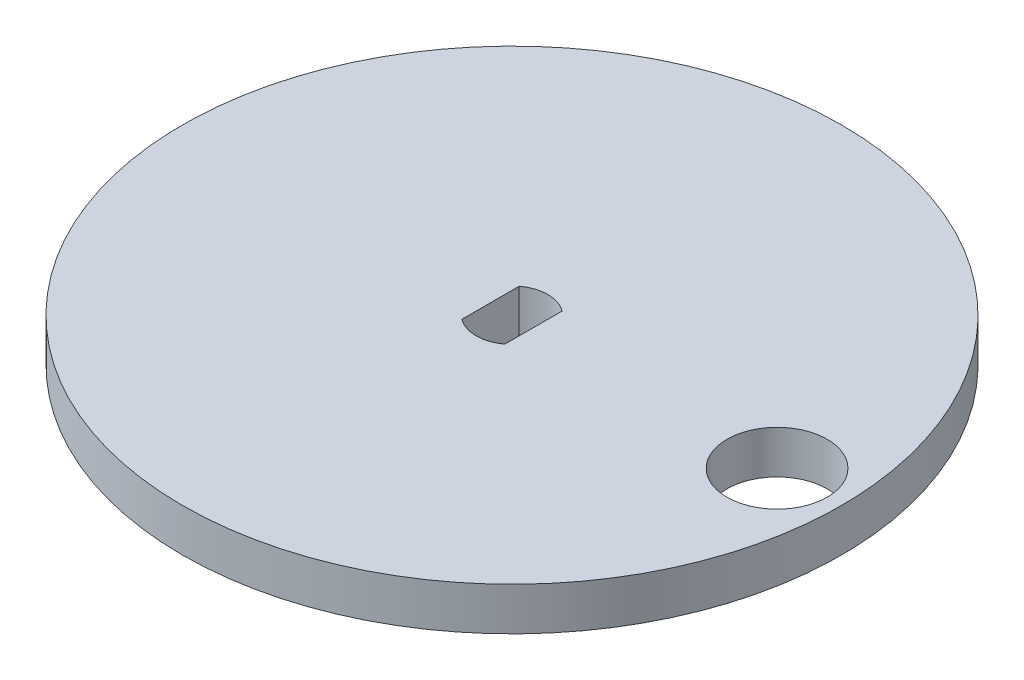
ISO-10303-21;
HEADER;
FILE_DESCRIPTION(('STEP AP214'),'2;1');
FILE_NAME('part.step','',(''),(''),'','','');
FILE_SCHEMA(('AUTOMOTIVE_DESIGN { 1 0 10303 214 1 1 1 1 }'));
ENDSEC;
DATA;
#1=APPLICATION_CONTEXT('core data for automotive mechanical design processes');
#2=APPLICATION_PROTOCOL_DEFINITION('international standard','automotive_design',2000,#1);
#3=PRODUCT_CONTEXT('',#1,'mechanical');
#4=PRODUCT('Part','Part','',(#3));
#5=PRODUCT_RELATED_PRODUCT_CATEGORY('part','',(#4));
#6=PRODUCT_DEFINITION_FORMATION('','',#4);
#7=PRODUCT_DEFINITION_CONTEXT('part definition',#1,'design');
#8=PRODUCT_DEFINITION('design','',#6,#7);
#9=PRODUCT_DEFINITION_SHAPE('','',#8);
#10=(LENGTH_UNIT() NAMED_UNIT(*) SI_UNIT(.MILLI.,.METRE.));
#11=(NAMED_UNIT(*) PLANE_ANGLE_UNIT() SI_UNIT($,.RADIAN.));
#12=(NAMED_UNIT(*) SI_UNIT($,.STERADIAN.) SOLID_ANGLE_UNIT());
#13=UNCERTAINTY_MEASURE_WITH_UNIT(LENGTH_MEASURE(1.E-05),#10,'distance_accuracy_value','');
#14=(GEOMETRIC_REPRESENTATION_CONTEXT(3) GLOBAL_UNCERTAINTY_ASSIGNED_CONTEXT((#13)) GLOBAL_UNIT_ASSIGNED_CONTEXT((#10,
#11,#12)) REPRESENTATION_CONTEXT('',''));
#15=CARTESIAN_POINT('',(0.,0.,0.));
#16=DIRECTION('',(0.,0.,1.));
#17=DIRECTION('',(1.,0.,0.));
#18=AXIS2_PLACEMENT_3D('',#15,#16,#17);
#19=CARTESIAN_POINT('',(0.,3.,0.));
#20=DIRECTION('',(0.,-1.,0.));
#21=DIRECTION('',(0.,0.,-1.));
#22=AXIS2_PLACEMENT_3D('',#19,#20,#21);
#23=CYLINDRICAL_SURFACE('',#22,2.5);
#24=CARTESIAN_POINT('',(0.,0.,0.));
#25=DIRECTION('',(0.,1.,0.));
#26=DIRECTION('',(0.,0.,1.));
#27=AXIS2_PLACEMENT_3D('',#24,#25,#26);
#28=CIRCLE('',#27,2.5);
#29=CARTESIAN_POINT('',(1.5,0.,-2.));
#30=VERTEX_POINT('',#29);
#31=CARTESIAN_POINT('',(-1.5,0.,-2.));
#32=VERTEX_POINT('',#31);
#33=EDGE_CURVE('E105',#30,#32,#28,.T.);
#34=ORIENTED_EDGE('',*,*,#33,.F.);
#35=DIRECTION('',(0.,-1.,0.));
#36=VECTOR('',#35,1.);
#37=CARTESIAN_POINT('',(1.5,3.,-2.));
#38=LINE('',#37,#36);
#39=CARTESIAN_POINT('',(1.5,3.,-2.));
#40=VERTEX_POINT('',#39);
#41=EDGE_CURVE('E11',#40,#30,#38,.T.);
#42=ORIENTED_EDGE('',*,*,#41,.F.);
#43=CARTESIAN_POINT('',(0.,3.,0.));
#44=DIRECTION('',(0.,1.,0.));
#45=DIRECTION('',(0.,0.,1.));
#46=AXIS2_PLACEMENT_3D('',#43,#44,#45);
#47=CIRCLE('',#46,2.5);
#48=CARTESIAN_POINT('',(-1.5,3.,-2.));
#49=VERTEX_POINT('',#48);
#50=EDGE_CURVE('E91',#40,#49,#47,.T.);
#51=ORIENTED_EDGE('',*,*,#50,.T.);
#52=DIRECTION('',(0.,-1.,0.));
#53=VECTOR('',#52,1.);
#54=CARTESIAN_POINT('',(-1.5,3.,-2.));
#55=LINE('',#54,#53);
#56=EDGE_CURVE('E51',#49,#32,#55,.T.);
#57=ORIENTED_EDGE('',*,*,#56,.T.);
#58=EDGE_LOOP('',(#34,#42,#51,#57));
#59=FACE_BOUND('',#58,.T.);
#60=ADVANCED_FACE('F35',(#59),#23,.F.);
#61=CARTESIAN_POINT('',(1.5,3.,0.));
#62=DIRECTION('',(-1.,0.,0.));
#63=DIRECTION('',(0.,0.,1.));
#64=AXIS2_PLACEMENT_3D('',#61,#62,#63);
#65=PLANE('',#64);
#66=DIRECTION('',(0.,0.,-1.));
#67=VECTOR('',#66,1.);
#68=CARTESIAN_POINT('',(1.5,0.,0.));
#69=LINE('',#68,#67);
#70=CARTESIAN_POINT('',(1.5,0.,2.));
#71=VERTEX_POINT('',#70);
#72=EDGE_CURVE('E81',#71,#30,#69,.T.);
#73=ORIENTED_EDGE('',*,*,#72,.F.);
#74=DIRECTION('',(0.,-1.,0.));
#75=VECTOR('',#74,1.);
#76=CARTESIAN_POINT('',(1.5,3.,2.));
#77=LINE('',#76,#75);
#78=CARTESIAN_POINT('',(1.5,3.,2.));
#79=VERTEX_POINT('',#78);
#80=EDGE_CURVE('E43',#79,#71,#77,.T.);
#81=ORIENTED_EDGE('',*,*,#80,.F.);
#82=DIRECTION('',(0.,0.,-1.));
#83=VECTOR('',#82,1.);
#84=CARTESIAN_POINT('',(1.5,3.,0.));
#85=LINE('',#84,#83);
#86=EDGE_CURVE('E79',#79,#40,#85,.T.);
#87=ORIENTED_EDGE('',*,*,#86,.T.);
#88=ORIENTED_EDGE('',*,*,#41,.T.);
#89=EDGE_LOOP('',(#73,#81,#87,#88));
#90=FACE_BOUND('',#89,.T.);
#91=ADVANCED_FACE('F78',(#90),#65,.T.);
#92=CARTESIAN_POINT('',(0.,3.,0.));
#93=DIRECTION('',(0.,-1.,0.));
#94=DIRECTION('',(0.,0.,-1.));
#95=AXIS2_PLACEMENT_3D('',#92,#93,#94);
#96=CYLINDRICAL_SURFACE('',#95,2.5);
#97=CARTESIAN_POINT('',(0.,0.,0.));
#98=DIRECTION('',(0.,1.,0.));
#99=DIRECTION('',(0.,0.,1.));
#100=AXIS2_PLACEMENT_3D('',#97,#98,#99);
#101=CIRCLE('',#100,2.5);
#102=CARTESIAN_POINT('',(-1.5,0.,2.));
#103=VERTEX_POINT('',#102);
#104=EDGE_CURVE('E108',#103,#71,#101,.T.);
#105=ORIENTED_EDGE('',*,*,#104,.F.);
#106=DIRECTION('',(0.,-1.,0.));
#107=VECTOR('',#106,1.);
#108=CARTESIAN_POINT('',(-1.5,3.,2.));
#109=LINE('',#108,#107);
#110=CARTESIAN_POINT('',(-1.5,3.,2.));
#111=VERTEX_POINT('',#110);
#112=EDGE_CURVE('E64',#111,#103,#109,.T.);
#113=ORIENTED_EDGE('',*,*,#112,.F.);
#114=CARTESIAN_POINT('',(0.,3.,0.));
#115=DIRECTION('',(0.,1.,0.));
#116=DIRECTION('',(0.,0.,1.));
#117=AXIS2_PLACEMENT_3D('',#114,#115,#116);
#118=CIRCLE('',#117,2.5);
#119=EDGE_CURVE('E90',#111,#79,#118,.T.);
#120=ORIENTED_EDGE('',*,*,#119,.T.);
#121=ORIENTED_EDGE('',*,*,#80,.T.);
#122=EDGE_LOOP('',(#105,#113,#120,#121));
#123=FACE_BOUND('',#122,.T.);
#124=ADVANCED_FACE('F93',(#123),#96,.F.);
#125=CARTESIAN_POINT('',(18.5,3.,0.));
#126=DIRECTION('',(0.,-1.,0.));
#127=DIRECTION('',(0.,0.,-1.));
#128=AXIS2_PLACEMENT_3D('',#125,#126,#127);
#129=CYLINDRICAL_SURFACE('',#128,3.5);
#130=CARTESIAN_POINT('',(18.5,3.,0.));
#131=DIRECTION('',(0.,1.,0.));
#132=DIRECTION('',(0.,0.,1.));
#133=AXIS2_PLACEMENT_3D('',#130,#131,#132);
#134=CIRCLE('',#133,3.5);
#135=CARTESIAN_POINT('',(18.5,3.,3.5));
#136=VERTEX_POINT('',#135);
#137=EDGE_CURVE('E96',#136,#136,#134,.T.);
#138=ORIENTED_EDGE('',*,*,#137,.T.);
#139=EDGE_LOOP('',(#138));
#140=FACE_BOUND('',#139,.T.);
#141=CARTESIAN_POINT('',(18.5,0.,0.));
#142=DIRECTION('',(0.,1.,0.));
#143=DIRECTION('',(0.,0.,1.));
#144=AXIS2_PLACEMENT_3D('',#141,#142,#143);
#145=CIRCLE('',#144,3.5);
#146=CARTESIAN_POINT('',(18.5,0.,3.5));
#147=VERTEX_POINT('',#146);
#148=EDGE_CURVE('E113',#147,#147,#145,.T.);
#149=ORIENTED_EDGE('',*,*,#148,.F.);
#150=EDGE_LOOP('',(#149));
#151=FACE_BOUND('',#150,.T.);
#152=ADVANCED_FACE('F125',(#140,#151),#129,.F.);
#153=CARTESIAN_POINT('',(-1.5,3.,0.));
#154=DIRECTION('',(1.,0.,0.));
#155=DIRECTION('',(0.,0.,-1.));
#156=AXIS2_PLACEMENT_3D('',#153,#154,#155);
#157=PLANE('',#156);
#158=DIRECTION('',(0.,0.,1.));
#159=VECTOR('',#158,1.);
#160=CARTESIAN_POINT('',(-1.5,0.,0.));
#161=LINE('',#160,#159);
#162=EDGE_CURVE('E110',#32,#103,#161,.T.);
#163=ORIENTED_EDGE('',*,*,#162,.F.);
#164=ORIENTED_EDGE('',*,*,#56,.F.);
#165=DIRECTION('',(0.,0.,1.));
#166=VECTOR('',#165,1.);
#167=CARTESIAN_POINT('',(-1.5,3.,0.));
#168=LINE('',#167,#166);
#169=EDGE_CURVE('E94',#49,#111,#168,.T.);
#170=ORIENTED_EDGE('',*,*,#169,.T.);
#171=ORIENTED_EDGE('',*,*,#112,.T.);
#172=EDGE_LOOP('',(#163,#164,#170,#171));
#173=FACE_BOUND('',#172,.T.);
#174=ADVANCED_FACE('F122',(#173),#157,.T.);
#175=CARTESIAN_POINT('',(0.,3.,0.));
#176=DIRECTION('',(0.,-1.,0.));
#177=DIRECTION('',(0.,0.,-1.));
#178=AXIS2_PLACEMENT_3D('',#175,#176,#177);
#179=CYLINDRICAL_SURFACE('',#178,23.);
#180=CARTESIAN_POINT('',(0.,3.,0.));
#181=DIRECTION('',(0.,1.,0.));
#182=DIRECTION('',(0.,0.,1.));
#183=AXIS2_PLACEMENT_3D('',#180,#181,#182);
#184=CIRCLE('',#183,23.);
#185=CARTESIAN_POINT('',(0.,3.,23.));
#186=VERTEX_POINT('',#185);
#187=EDGE_CURVE('E102',#186,#186,#184,.T.);
#188=ORIENTED_EDGE('',*,*,#187,.F.);
#189=EDGE_LOOP('',(#188));
#190=FACE_BOUND('',#189,.T.);
#191=CARTESIAN_POINT('',(0.,0.,0.));
#192=DIRECTION('',(0.,1.,0.));
#193=DIRECTION('',(0.,0.,1.));
#194=AXIS2_PLACEMENT_3D('',#191,#192,#193);
#195=CIRCLE('',#194,23.);
#196=CARTESIAN_POINT('',(0.,0.,23.));
#197=VERTEX_POINT('',#196);
#198=EDGE_CURVE('E116',#197,#197,#195,.T.);
#199=ORIENTED_EDGE('',*,*,#198,.T.);
#200=EDGE_LOOP('',(#199));
#201=FACE_BOUND('',#200,.T.);
#202=ADVANCED_FACE('F124',(#190,#201),#179,.T.);
#203=CARTESIAN_POINT('',(0.,3.,0.));
#204=DIRECTION('',(0.,1.,0.));
#205=DIRECTION('',(0.,0.,1.));
#206=AXIS2_PLACEMENT_3D('',#203,#204,#205);
#207=PLANE('',#206);
#208=ORIENTED_EDGE('',*,*,#50,.F.);
#209=ORIENTED_EDGE('',*,*,#86,.F.);
#210=ORIENTED_EDGE('',*,*,#119,.F.);
#211=ORIENTED_EDGE('',*,*,#169,.F.);
#212=EDGE_LOOP('',(#208,#209,#210,#211));
#213=FACE_BOUND('',#212,.T.);
#214=ORIENTED_EDGE('',*,*,#137,.F.);
#215=EDGE_LOOP('',(#214));
#216=FACE_BOUND('',#215,.T.);
#217=ORIENTED_EDGE('',*,*,#187,.T.);
#218=EDGE_LOOP('',(#217));
#219=FACE_BOUND('',#218,.T.);
#220=ADVANCED_FACE('F87',(#213,#216,#219),#207,.T.);
#221=CARTESIAN_POINT('',(0.,0.,0.));
#222=DIRECTION('',(0.,1.,0.));
#223=DIRECTION('',(0.,0.,1.));
#224=AXIS2_PLACEMENT_3D('',#221,#222,#223);
#225=PLANE('',#224);
#226=ORIENTED_EDGE('',*,*,#33,.T.);
#227=ORIENTED_EDGE('',*,*,#162,.T.);
#228=ORIENTED_EDGE('',*,*,#104,.T.);
#229=ORIENTED_EDGE('',*,*,#72,.T.);
#230=EDGE_LOOP('',(#226,#227,#228,#229));
#231=FACE_BOUND('',#230,.T.);
#232=ORIENTED_EDGE('',*,*,#148,.T.);
#233=EDGE_LOOP('',(#232));
#234=FACE_BOUND('',#233,.T.);
#235=ORIENTED_EDGE('',*,*,#198,.F.);
#236=EDGE_LOOP('',(#235));
#237=FACE_BOUND('',#236,.T.);
#238=ADVANCED_FACE('F169',(#231,#234,#237),#225,.F.);
#239=CLOSED_SHELL('',(#60,#91,#124,#152,#174,#202,#220,#238));
#240=MANIFOLD_SOLID_BREP('B2',#239);
#241=ADVANCED_BREP_SHAPE_REPRESENTATION('',(#18,#240),#14);
#242=SHAPE_DEFINITION_REPRESENTATION(#9,#241);
ENDSEC;
END-ISO-10303-21;
